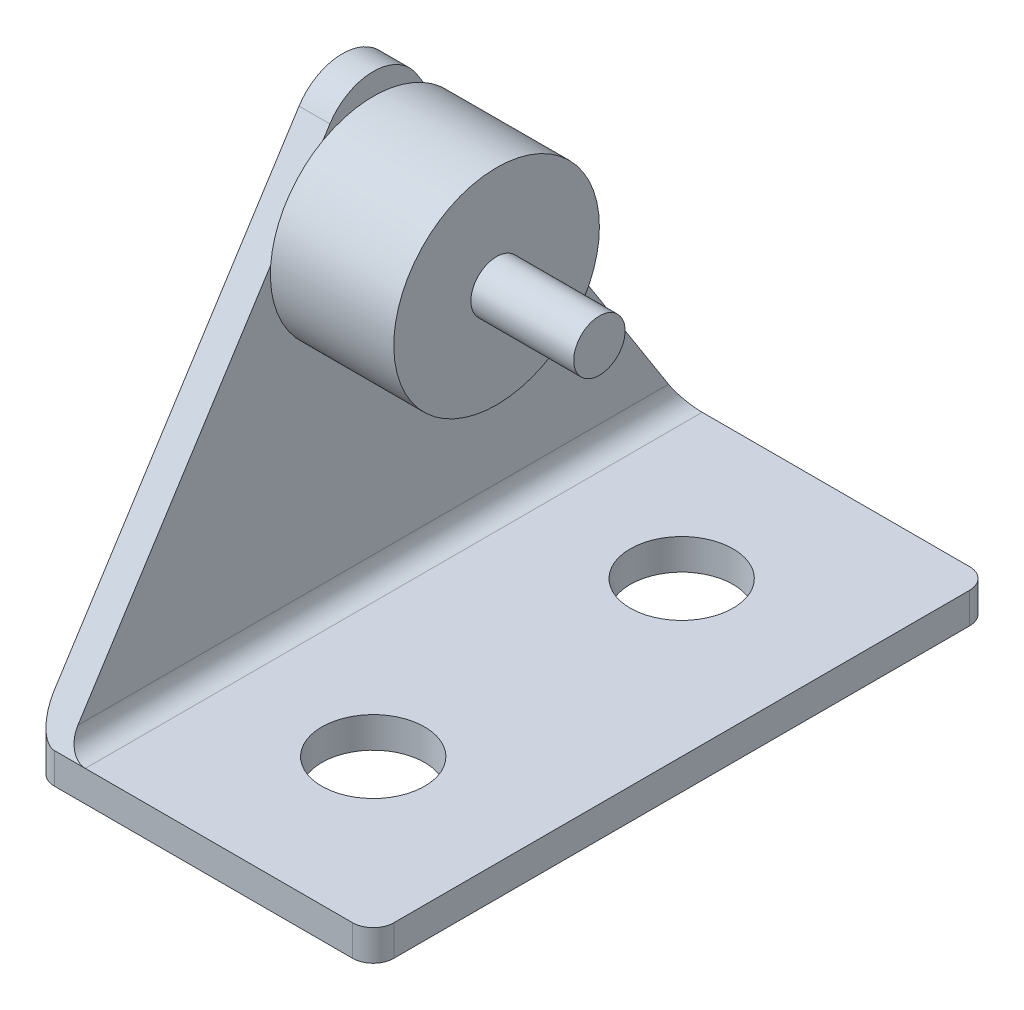
ISO-10303-21;
HEADER;
FILE_DESCRIPTION(('STEP AP214'),'2;1');
FILE_NAME('part.step','',(''),(''),'','','');
FILE_SCHEMA(('AUTOMOTIVE_DESIGN { 1 0 10303 214 1 1 1 1 }'));
ENDSEC;
DATA;
#1=APPLICATION_CONTEXT('core data for automotive mechanical design processes');
#2=APPLICATION_PROTOCOL_DEFINITION('international standard','automotive_design',2000,#1);
#3=PRODUCT_CONTEXT('',#1,'mechanical');
#4=PRODUCT('Part','Part','',(#3));
#5=PRODUCT_RELATED_PRODUCT_CATEGORY('part','',(#4));
#6=PRODUCT_DEFINITION_FORMATION('','',#4);
#7=PRODUCT_DEFINITION_CONTEXT('part definition',#1,'design');
#8=PRODUCT_DEFINITION('design','',#6,#7);
#9=PRODUCT_DEFINITION_SHAPE('','',#8);
#10=(LENGTH_UNIT() NAMED_UNIT(*) SI_UNIT(.MILLI.,.METRE.));
#11=(NAMED_UNIT(*) PLANE_ANGLE_UNIT() SI_UNIT($,.RADIAN.));
#12=(NAMED_UNIT(*) SI_UNIT($,.STERADIAN.) SOLID_ANGLE_UNIT());
#13=UNCERTAINTY_MEASURE_WITH_UNIT(LENGTH_MEASURE(1.E-05),#10,'distance_accuracy_value','');
#14=(GEOMETRIC_REPRESENTATION_CONTEXT(3) GLOBAL_UNCERTAINTY_ASSIGNED_CONTEXT((#13)) GLOBAL_UNIT_ASSIGNED_CONTEXT((#10,
#11,#12)) REPRESENTATION_CONTEXT('',''));
#15=CARTESIAN_POINT('',(0.,0.,0.));
#16=DIRECTION('',(0.,0.,1.));
#17=DIRECTION('',(1.,0.,0.));
#18=AXIS2_PLACEMENT_3D('',#15,#16,#17);
#19=CARTESIAN_POINT('',(3.81,3.80999999999999,38.1));
#20=DIRECTION('',(-1.,0.,0.));
#21=DIRECTION('',(0.,0.,1.));
#22=AXIS2_PLACEMENT_3D('',#19,#20,#21);
#23=PLANE('',#22);
#24=CARTESIAN_POINT('',(3.81,42.6920214745365,0.));
#25=DIRECTION('',(1.,0.,0.));
#26=DIRECTION('',(0.,0.,-1.));
#27=AXIS2_PLACEMENT_3D('',#24,#25,#26);
#28=CIRCLE('',#27,12.7);
#29=CARTESIAN_POINT('',(3.81,53.7697444122996,-6.21080143895773));
#30=VERTEX_POINT('',#29);
#31=CARTESIAN_POINT('',(3.81,53.7697444122995,6.21080143895775));
#32=VERTEX_POINT('',#31);
#33=EDGE_CURVE('E193',#30,#32,#28,.T.);
#34=ORIENTED_EDGE('',*,*,#33,.F.);
#35=DIRECTION('',(0.,-0.842922209577588,-0.538035452921865));
#36=VECTOR('',#35,1.);
#37=CARTESIAN_POINT('',(3.81,18.3821164361531,-28.7986490833065));
#38=LINE('',#37,#36);
#39=CARTESIAN_POINT('',(3.81,55.1143288850523,-5.35255603081767));
#40=VERTEX_POINT('',#39);
#41=EDGE_CURVE('E203',#40,#30,#38,.T.);
#42=ORIENTED_EDGE('',*,*,#41,.F.);
#43=CARTESIAN_POINT('',(3.80999999999999,51.6978037589984,0.));
#44=DIRECTION('',(-1.,0.,0.));
#45=DIRECTION('',(0.,0.,1.));
#46=AXIS2_PLACEMENT_3D('',#43,#44,#45);
#47=CIRCLE('',#46,6.35);
#48=CARTESIAN_POINT('',(3.81,55.1143288850523,5.3525560308177));
#49=VERTEX_POINT('',#48);
#50=EDGE_CURVE('E261',#40,#49,#47,.F.);
#51=ORIENTED_EDGE('',*,*,#50,.T.);
#52=DIRECTION('',(0.,0.842922209577588,-0.538035452921865));
#53=VECTOR('',#52,1.);
#54=CARTESIAN_POINT('',(3.81,18.3821164361531,28.7986490833065));
#55=LINE('',#54,#53);
#56=EDGE_CURVE('E204',#32,#49,#55,.T.);
#57=ORIENTED_EDGE('',*,*,#56,.F.);
#58=EDGE_LOOP('',(#34,#42,#51,#57));
#59=FACE_BOUND('',#58,.T.);
#60=ADVANCED_FACE('F77',(#59),#23,.F.);
#61=CARTESIAN_POINT('',(0.,0.,38.1));
#62=DIRECTION('',(0.,1.,0.));
#63=DIRECTION('',(0.,0.,1.));
#64=AXIS2_PLACEMENT_3D('',#61,#62,#63);
#65=PLANE('',#64);
#66=CARTESIAN_POINT('',(22.86,0.,19.05));
#67=DIRECTION('',(0.,1.,0.));
#68=DIRECTION('',(0.,0.,1.));
#69=AXIS2_PLACEMENT_3D('',#66,#67,#68);
#70=CIRCLE('',#69,6.35);
#71=CARTESIAN_POINT('',(16.51,0.,19.05));
#72=VERTEX_POINT('',#71);
#73=EDGE_CURVE('E394',#72,#72,#70,.T.);
#74=ORIENTED_EDGE('',*,*,#73,.T.);
#75=EDGE_LOOP('',(#74));
#76=FACE_BOUND('',#75,.T.);
#77=CARTESIAN_POINT('',(22.86,0.,-19.05));
#78=DIRECTION('',(0.,1.,0.));
#79=DIRECTION('',(0.,0.,1.));
#80=AXIS2_PLACEMENT_3D('',#77,#78,#79);
#81=CIRCLE('',#80,6.35);
#82=CARTESIAN_POINT('',(16.51,0.,-19.05));
#83=VERTEX_POINT('',#82);
#84=EDGE_CURVE('E399',#83,#83,#81,.T.);
#85=ORIENTED_EDGE('',*,*,#84,.T.);
#86=EDGE_LOOP('',(#85));
#87=FACE_BOUND('',#86,.T.);
#88=DIRECTION('',(0.,0.,-1.));
#89=VECTOR('',#88,1.);
#90=CARTESIAN_POINT('',(0.,0.,38.1));
#91=LINE('',#90,#89);
#92=CARTESIAN_POINT('',(0.,0.,35.56));
#93=VERTEX_POINT('',#92);
#94=CARTESIAN_POINT('',(0.,0.,-35.56));
#95=VERTEX_POINT('',#94);
#96=EDGE_CURVE('E246',#93,#95,#91,.T.);
#97=ORIENTED_EDGE('',*,*,#96,.T.);
#98=CARTESIAN_POINT('',(2.54,0.,-35.56));
#99=DIRECTION('',(0.,1.,0.));
#100=DIRECTION('',(0.,0.,1.));
#101=AXIS2_PLACEMENT_3D('',#98,#99,#100);
#102=CIRCLE('',#101,2.54);
#103=CARTESIAN_POINT('',(2.54,0.,-38.1));
#104=VERTEX_POINT('',#103);
#105=EDGE_CURVE('E287',#95,#104,#102,.F.);
#106=ORIENTED_EDGE('',*,*,#105,.T.);
#107=DIRECTION('',(1.,0.,0.));
#108=VECTOR('',#107,1.);
#109=CARTESIAN_POINT('',(0.,0.,-38.1));
#110=LINE('',#109,#108);
#111=CARTESIAN_POINT('',(39.37,0.,-38.1));
#112=VERTEX_POINT('',#111);
#113=EDGE_CURVE('E236',#104,#112,#110,.T.);
#114=ORIENTED_EDGE('',*,*,#113,.T.);
#115=CARTESIAN_POINT('',(39.37,0.,-35.56));
#116=DIRECTION('',(0.,1.,0.));
#117=DIRECTION('',(0.,0.,1.));
#118=AXIS2_PLACEMENT_3D('',#115,#116,#117);
#119=CIRCLE('',#118,2.54);
#120=CARTESIAN_POINT('',(41.91,0.,-35.56));
#121=VERTEX_POINT('',#120);
#122=EDGE_CURVE('E281',#112,#121,#119,.F.);
#123=ORIENTED_EDGE('',*,*,#122,.T.);
#124=DIRECTION('',(0.,0.,1.));
#125=VECTOR('',#124,1.);
#126=CARTESIAN_POINT('',(41.91,0.,38.1));
#127=LINE('',#126,#125);
#128=CARTESIAN_POINT('',(41.91,0.,35.56));
#129=VERTEX_POINT('',#128);
#130=EDGE_CURVE('E222',#121,#129,#127,.T.);
#131=ORIENTED_EDGE('',*,*,#130,.T.);
#132=CARTESIAN_POINT('',(39.37,0.,35.56));
#133=DIRECTION('',(0.,1.,0.));
#134=DIRECTION('',(0.,0.,1.));
#135=AXIS2_PLACEMENT_3D('',#132,#133,#134);
#136=CIRCLE('',#135,2.54);
#137=CARTESIAN_POINT('',(39.37,0.,38.1));
#138=VERTEX_POINT('',#137);
#139=EDGE_CURVE('E278',#129,#138,#136,.F.);
#140=ORIENTED_EDGE('',*,*,#139,.T.);
#141=DIRECTION('',(1.,0.,0.));
#142=VECTOR('',#141,1.);
#143=CARTESIAN_POINT('',(0.,0.,38.1));
#144=LINE('',#143,#142);
#145=CARTESIAN_POINT('',(2.54,0.,38.1));
#146=VERTEX_POINT('',#145);
#147=EDGE_CURVE('E237',#146,#138,#144,.T.);
#148=ORIENTED_EDGE('',*,*,#147,.F.);
#149=CARTESIAN_POINT('',(2.54,0.,35.56));
#150=DIRECTION('',(0.,1.,0.));
#151=DIRECTION('',(0.,0.,1.));
#152=AXIS2_PLACEMENT_3D('',#149,#150,#151);
#153=CIRCLE('',#152,2.54);
#154=EDGE_CURVE('E284',#146,#93,#153,.F.);
#155=ORIENTED_EDGE('',*,*,#154,.T.);
#156=EDGE_LOOP('',(#97,#106,#114,#123,#131,#140,#148,#155));
#157=FACE_BOUND('',#156,.T.);
#158=ADVANCED_FACE('F358',(#76,#87,#157),#65,.F.);
#159=CARTESIAN_POINT('',(63.5,3.81,38.1));
#160=DIRECTION('',(0.,-1.,0.));
#161=DIRECTION('',(1.,0.,0.));
#162=AXIS2_PLACEMENT_3D('',#159,#160,#161);
#163=PLANE('',#162);
#164=CARTESIAN_POINT('',(22.86,3.80999999999999,19.05));
#165=DIRECTION('',(0.,1.,0.));
#166=DIRECTION('',(-1.,0.,0.));
#167=AXIS2_PLACEMENT_3D('',#164,#165,#166);
#168=CIRCLE('',#167,6.35);
#169=CARTESIAN_POINT('',(16.51,3.80999999999999,19.05));
#170=VERTEX_POINT('',#169);
#171=EDGE_CURVE('E403',#170,#170,#168,.T.);
#172=ORIENTED_EDGE('',*,*,#171,.F.);
#173=EDGE_LOOP('',(#172));
#174=FACE_BOUND('',#173,.T.);
#175=CARTESIAN_POINT('',(22.86,3.80999999999999,-19.05));
#176=DIRECTION('',(0.,1.,0.));
#177=DIRECTION('',(-1.,0.,0.));
#178=AXIS2_PLACEMENT_3D('',#175,#176,#177);
#179=CIRCLE('',#178,6.35);
#180=CARTESIAN_POINT('',(16.51,3.80999999999999,-19.05));
#181=VERTEX_POINT('',#180);
#182=EDGE_CURVE('E404',#181,#181,#179,.T.);
#183=ORIENTED_EDGE('',*,*,#182,.F.);
#184=EDGE_LOOP('',(#183));
#185=FACE_BOUND('',#184,.T.);
#186=DIRECTION('',(-1.,0.,0.));
#187=VECTOR('',#186,1.);
#188=CARTESIAN_POINT('',(63.5,3.81,-38.1));
#189=LINE('',#188,#187);
#190=CARTESIAN_POINT('',(39.37,3.81,-38.1));
#191=VERTEX_POINT('',#190);
#192=CARTESIAN_POINT('',(6.35000000000002,3.80999999999999,-38.1));
#193=VERTEX_POINT('',#192);
#194=EDGE_CURVE('E242',#191,#193,#189,.T.);
#195=ORIENTED_EDGE('',*,*,#194,.T.);
#196=DIRECTION('',(0.,0.,-1.));
#197=VECTOR('',#196,1.);
#198=CARTESIAN_POINT('',(6.35,3.80999999999999,38.1));
#199=LINE('',#198,#197);
#200=CARTESIAN_POINT('',(6.35,3.80999999999999,38.1));
#201=VERTEX_POINT('',#200);
#202=EDGE_CURVE('E327',#193,#201,#199,.F.);
#203=ORIENTED_EDGE('',*,*,#202,.T.);
#204=DIRECTION('',(-1.,0.,0.));
#205=VECTOR('',#204,1.);
#206=CARTESIAN_POINT('',(63.5,3.81,38.1));
#207=LINE('',#206,#205);
#208=CARTESIAN_POINT('',(39.37,3.81,38.1));
#209=VERTEX_POINT('',#208);
#210=EDGE_CURVE('E241',#209,#201,#207,.T.);
#211=ORIENTED_EDGE('',*,*,#210,.F.);
#212=CARTESIAN_POINT('',(39.37,3.81,35.56));
#213=DIRECTION('',(0.,-1.,0.));
#214=DIRECTION('',(1.,0.,0.));
#215=AXIS2_PLACEMENT_3D('',#212,#213,#214);
#216=CIRCLE('',#215,2.54);
#217=CARTESIAN_POINT('',(41.91,3.81,35.56));
#218=VERTEX_POINT('',#217);
#219=EDGE_CURVE('E317',#209,#218,#216,.F.);
#220=ORIENTED_EDGE('',*,*,#219,.T.);
#221=DIRECTION('',(0.,0.,1.));
#222=VECTOR('',#221,1.);
#223=CARTESIAN_POINT('',(41.91,3.81,38.1));
#224=LINE('',#223,#222);
#225=CARTESIAN_POINT('',(41.91,3.81,-35.56));
#226=VERTEX_POINT('',#225);
#227=EDGE_CURVE('E386',#226,#218,#224,.T.);
#228=ORIENTED_EDGE('',*,*,#227,.F.);
#229=CARTESIAN_POINT('',(39.37,3.80999999999999,-35.56));
#230=DIRECTION('',(0.,-1.,0.));
#231=DIRECTION('',(1.,0.,0.));
#232=AXIS2_PLACEMENT_3D('',#229,#230,#231);
#233=CIRCLE('',#232,2.54);
#234=EDGE_CURVE('E320',#226,#191,#233,.F.);
#235=ORIENTED_EDGE('',*,*,#234,.T.);
#236=EDGE_LOOP('',(#195,#203,#211,#220,#228,#235));
#237=FACE_BOUND('',#236,.T.);
#238=ADVANCED_FACE('F370',(#174,#185,#237),#163,.F.);
#239=CARTESIAN_POINT('',(3.81,43.661375199956,12.6629520000281));
#240=VERTEX_POINT('',#239);
#241=CARTESIAN_POINT('',(3.81,43.661375199956,-12.6629520000281));
#242=VERTEX_POINT('',#241);
#243=EDGE_CURVE('E196',#240,#242,#28,.T.);
#244=ORIENTED_EDGE('',*,*,#243,.F.);
#245=CARTESIAN_POINT('',(3.81,6.34999999999999,36.4787234042553));
#246=VERTEX_POINT('',#245);
#247=EDGE_CURVE('E229',#246,#240,#55,.T.);
#248=ORIENTED_EDGE('',*,*,#247,.F.);
#249=DIRECTION('',(0.,0.,-1.));
#250=VECTOR('',#249,1.);
#251=CARTESIAN_POINT('',(3.81,6.34999999999999,-38.1));
#252=LINE('',#251,#250);
#253=CARTESIAN_POINT('',(3.81,6.34999999999999,-36.4787234042553));
#254=VERTEX_POINT('',#253);
#255=EDGE_CURVE('E323',#246,#254,#252,.T.);
#256=ORIENTED_EDGE('',*,*,#255,.T.);
#257=EDGE_CURVE('E214',#242,#254,#38,.T.);
#258=ORIENTED_EDGE('',*,*,#257,.F.);
#259=EDGE_LOOP('',(#244,#248,#256,#258));
#260=FACE_BOUND('',#259,.T.);
#261=ADVANCED_FACE('F346',(#260),#23,.F.);
#262=CARTESIAN_POINT('',(0.,0.,38.1));
#263=DIRECTION('',(1.,0.,0.));
#264=DIRECTION('',(0.,0.,-1.));
#265=AXIS2_PLACEMENT_3D('',#262,#263,#264);
#266=PLANE('',#265);
#267=CARTESIAN_POINT('',(0.,42.6920214745365,0.));
#268=DIRECTION('',(1.,0.,0.));
#269=DIRECTION('',(0.,0.,-1.));
#270=AXIS2_PLACEMENT_3D('',#267,#268,#269);
#271=CIRCLE('',#270,6.5024);
#272=CARTESIAN_POINT('',(0.,42.6920214745365,-6.5024));
#273=VERTEX_POINT('',#272);
#274=EDGE_CURVE('E81',#273,#273,#271,.T.);
#275=ORIENTED_EDGE('',*,*,#274,.T.);
#276=EDGE_LOOP('',(#275));
#277=FACE_BOUND('',#276,.T.);
#278=DIRECTION('',(0.,-0.842922209577588,-0.538035452921865));
#279=VECTOR('',#278,1.);
#280=CARTESIAN_POINT('',(0.,35.661305886137,-17.7693792216147));
#281=LINE('',#280,#279);
#282=CARTESIAN_POINT('',(0.,55.1143288850523,-5.35255603081768));
#283=VERTEX_POINT('',#282);
#284=CARTESIAN_POINT('',(0.,7.78933333333333,-35.56));
#285=VERTEX_POINT('',#284);
#286=EDGE_CURVE('E220',#283,#285,#281,.T.);
#287=ORIENTED_EDGE('',*,*,#286,.T.);
#288=DIRECTION('',(0.,-1.,0.));
#289=VECTOR('',#288,1.);
#290=CARTESIAN_POINT('',(0.,0.,-35.56));
#291=LINE('',#290,#289);
#292=EDGE_CURVE('E274',#285,#95,#291,.T.);
#293=ORIENTED_EDGE('',*,*,#292,.T.);
#294=ORIENTED_EDGE('',*,*,#96,.F.);
#295=DIRECTION('',(0.,-1.,0.));
#296=VECTOR('',#295,1.);
#297=CARTESIAN_POINT('',(0.,0.,35.56));
#298=LINE('',#297,#296);
#299=CARTESIAN_POINT('',(0.,7.78933333333333,35.56));
#300=VERTEX_POINT('',#299);
#301=EDGE_CURVE('E271',#93,#300,#298,.F.);
#302=ORIENTED_EDGE('',*,*,#301,.T.);
#303=DIRECTION('',(0.,0.842922209577588,-0.538035452921865));
#304=VECTOR('',#303,1.);
#305=CARTESIAN_POINT('',(0.,1.10292698616918,39.8279189449984));
#306=LINE('',#305,#304);
#307=CARTESIAN_POINT('',(0.,55.1143288850523,5.3525560308177));
#308=VERTEX_POINT('',#307);
#309=EDGE_CURVE('E233',#300,#308,#306,.T.);
#310=ORIENTED_EDGE('',*,*,#309,.T.);
#311=CARTESIAN_POINT('',(0.,51.6978037589984,0.));
#312=DIRECTION('',(1.,0.,0.));
#313=DIRECTION('',(0.,0.,-1.));
#314=AXIS2_PLACEMENT_3D('',#311,#312,#313);
#315=CIRCLE('',#314,6.35);
#316=EDGE_CURVE('E268',#308,#283,#315,.F.);
#317=ORIENTED_EDGE('',*,*,#316,.T.);
#318=EDGE_LOOP('',(#287,#293,#294,#302,#310,#317));
#319=FACE_BOUND('',#318,.T.);
#320=ADVANCED_FACE('F355',(#277,#319),#266,.F.);
#321=CARTESIAN_POINT('',(0.,0.,38.1));
#322=DIRECTION('',(0.,0.,-1.));
#323=DIRECTION('',(-1.,0.,0.));
#324=AXIS2_PLACEMENT_3D('',#321,#322,#323);
#325=PLANE('',#324);
#326=DIRECTION('',(-1.,0.,0.));
#327=VECTOR('',#326,1.);
#328=CARTESIAN_POINT('',(0.,3.80999999999999,38.1));
#329=LINE('',#328,#327);
#330=CARTESIAN_POINT('',(2.54,3.80999999999999,38.1));
#331=VERTEX_POINT('',#330);
#332=EDGE_CURVE('E255',#201,#331,#329,.T.);
#333=ORIENTED_EDGE('',*,*,#332,.T.);
#334=DIRECTION('',(0.,-1.,0.));
#335=VECTOR('',#334,1.);
#336=CARTESIAN_POINT('',(2.54,0.,38.1));
#337=LINE('',#336,#335);
#338=EDGE_CURVE('E303',#331,#146,#337,.T.);
#339=ORIENTED_EDGE('',*,*,#338,.T.);
#340=ORIENTED_EDGE('',*,*,#147,.T.);
#341=DIRECTION('',(0.,1.,0.));
#342=VECTOR('',#341,1.);
#343=CARTESIAN_POINT('',(39.37,0.,38.1));
#344=LINE('',#343,#342);
#345=EDGE_CURVE('E299',#138,#209,#344,.T.);
#346=ORIENTED_EDGE('',*,*,#345,.T.);
#347=ORIENTED_EDGE('',*,*,#210,.T.);
#348=EDGE_LOOP('',(#333,#339,#340,#346,#347));
#349=FACE_BOUND('',#348,.T.);
#350=ADVANCED_FACE('F366',(#349),#325,.F.);
#351=CARTESIAN_POINT('',(0.,0.,-38.1));
#352=DIRECTION('',(0.,0.,-1.));
#353=DIRECTION('',(-1.,0.,0.));
#354=AXIS2_PLACEMENT_3D('',#351,#352,#353);
#355=PLANE('',#354);
#356=ORIENTED_EDGE('',*,*,#113,.F.);
#357=DIRECTION('',(0.,-1.,0.));
#358=VECTOR('',#357,1.);
#359=CARTESIAN_POINT('',(2.54,3.80999999999999,-38.1));
#360=LINE('',#359,#358);
#361=CARTESIAN_POINT('',(2.53999999999997,3.80999999999999,-38.1));
#362=VERTEX_POINT('',#361);
#363=EDGE_CURVE('E293',#104,#362,#360,.F.);
#364=ORIENTED_EDGE('',*,*,#363,.T.);
#365=DIRECTION('',(1.,0.,0.));
#366=VECTOR('',#365,1.);
#367=CARTESIAN_POINT('',(-72.39,3.80999999999999,-38.1));
#368=LINE('',#367,#366);
#369=EDGE_CURVE('E103',#362,#193,#368,.T.);
#370=ORIENTED_EDGE('',*,*,#369,.T.);
#371=ORIENTED_EDGE('',*,*,#194,.F.);
#372=DIRECTION('',(0.,1.,0.));
#373=VECTOR('',#372,1.);
#374=CARTESIAN_POINT('',(39.37,0.,-38.1));
#375=LINE('',#374,#373);
#376=EDGE_CURVE('E290',#191,#112,#375,.F.);
#377=ORIENTED_EDGE('',*,*,#376,.T.);
#378=EDGE_LOOP('',(#356,#364,#370,#371,#377));
#379=FACE_BOUND('',#378,.T.);
#380=ADVANCED_FACE('F374',(#379),#355,.T.);
#381=CARTESIAN_POINT('',(-72.39,18.3821164361531,28.7986490833065));
#382=DIRECTION('',(0.,-0.538035452921865,-0.842922209577588));
#383=DIRECTION('',(0.,0.842922209577589,-0.538035452921865));
#384=AXIS2_PLACEMENT_3D('',#381,#382,#383);
#385=PLANE('',#384);
#386=ORIENTED_EDGE('',*,*,#309,.F.);
#387=CARTESIAN_POINT('',(2.54,7.78933333333332,35.56));
#388=DIRECTION('',(0.,-0.538035452921865,-0.842922209577588));
#389=DIRECTION('',(0.,-0.842922209577588,0.538035452921865));
#390=AXIS2_PLACEMENT_3D('',#387,#388,#389);
#391=ELLIPSE('',#390,4.72087849640062,2.54);
#392=EDGE_CURVE('E307',#300,#331,#391,.F.);
#393=ORIENTED_EDGE('',*,*,#392,.T.);
#394=ORIENTED_EDGE('',*,*,#332,.F.);
#395=CARTESIAN_POINT('',(6.35,6.34999999999999,36.4787234042553));
#396=DIRECTION('',(0.,-0.538035452921865,-0.842922209577588));
#397=DIRECTION('',(0.,-0.842922209577588,0.538035452921865));
#398=AXIS2_PLACEMENT_3D('',#395,#396,#397);
#399=ELLIPSE('',#398,3.01332669983018,2.54);
#400=EDGE_CURVE('E87',#201,#246,#399,.T.);
#401=ORIENTED_EDGE('',*,*,#400,.T.);
#402=ORIENTED_EDGE('',*,*,#247,.T.);
#403=DIRECTION('',(0.,-0.842922209577589,0.538035452921865));
#404=VECTOR('',#403,1.);
#405=CARTESIAN_POINT('',(3.80999999999999,18.3821164361531,28.7986490833065));
#406=LINE('',#405,#404);
#407=EDGE_CURVE('E185',#32,#240,#406,.T.);
#408=ORIENTED_EDGE('',*,*,#407,.F.);
#409=ORIENTED_EDGE('',*,*,#56,.T.);
#410=DIRECTION('',(1.,0.,0.));
#411=VECTOR('',#410,1.);
#412=CARTESIAN_POINT('',(-72.39,55.1143288850523,5.35255603081769));
#413=LINE('',#412,#411);
#414=EDGE_CURVE('E264',#49,#308,#413,.F.);
#415=ORIENTED_EDGE('',*,*,#414,.T.);
#416=EDGE_LOOP('',(#386,#393,#394,#401,#402,#408,#409,#415));
#417=FACE_BOUND('',#416,.T.);
#418=ADVANCED_FACE('F341',(#417),#385,.F.);
#419=CARTESIAN_POINT('',(-72.39,18.3821164361531,-28.7986490833065));
#420=DIRECTION('',(0.,-0.538035452921865,0.842922209577588));
#421=DIRECTION('',(0.,-0.842922209577588,-0.538035452921865));
#422=AXIS2_PLACEMENT_3D('',#419,#420,#421);
#423=PLANE('',#422);
#424=ORIENTED_EDGE('',*,*,#369,.F.);
#425=CARTESIAN_POINT('',(2.54,7.78933333333333,-35.56));
#426=DIRECTION('',(0.,-0.538035452921865,0.842922209577588));
#427=DIRECTION('',(0.,0.842922209577588,0.538035452921865));
#428=AXIS2_PLACEMENT_3D('',#425,#426,#427);
#429=ELLIPSE('',#428,4.72087849640062,2.54);
#430=EDGE_CURVE('E296',#362,#285,#429,.F.);
#431=ORIENTED_EDGE('',*,*,#430,.T.);
#432=ORIENTED_EDGE('',*,*,#286,.F.);
#433=DIRECTION('',(1.,0.,0.));
#434=VECTOR('',#433,1.);
#435=CARTESIAN_POINT('',(-72.39,55.1143288850523,-5.35255603081768));
#436=LINE('',#435,#434);
#437=EDGE_CURVE('E212',#283,#40,#436,.T.);
#438=ORIENTED_EDGE('',*,*,#437,.T.);
#439=ORIENTED_EDGE('',*,*,#41,.T.);
#440=DIRECTION('',(0.,0.842922209577588,0.538035452921865));
#441=VECTOR('',#440,1.);
#442=CARTESIAN_POINT('',(3.80999999999999,18.3821164361531,-28.7986490833065));
#443=LINE('',#442,#441);
#444=EDGE_CURVE('E180',#242,#30,#443,.T.);
#445=ORIENTED_EDGE('',*,*,#444,.F.);
#446=ORIENTED_EDGE('',*,*,#257,.T.);
#447=CARTESIAN_POINT('',(6.35,6.34999999999999,-36.4787234042553));
#448=DIRECTION('',(0.,-0.538035452921865,0.842922209577588));
#449=DIRECTION('',(0.,0.842922209577588,0.538035452921865));
#450=AXIS2_PLACEMENT_3D('',#447,#448,#449);
#451=ELLIPSE('',#450,3.01332669983018,2.54);
#452=EDGE_CURVE('E331',#254,#193,#451,.T.);
#453=ORIENTED_EDGE('',*,*,#452,.T.);
#454=EDGE_LOOP('',(#424,#431,#432,#438,#439,#445,#446,#453));
#455=FACE_BOUND('',#454,.T.);
#456=ADVANCED_FACE('F209',(#455),#423,.F.);
#457=CARTESIAN_POINT('',(-72.39,51.6978037589984,0.));
#458=DIRECTION('',(1.,0.,0.));
#459=DIRECTION('',(0.,0.,-1.));
#460=AXIS2_PLACEMENT_3D('',#457,#458,#459);
#461=CYLINDRICAL_SURFACE('',#460,6.35);
#462=ORIENTED_EDGE('',*,*,#316,.F.);
#463=ORIENTED_EDGE('',*,*,#414,.F.);
#464=ORIENTED_EDGE('',*,*,#50,.F.);
#465=ORIENTED_EDGE('',*,*,#437,.F.);
#466=EDGE_LOOP('',(#462,#463,#464,#465));
#467=FACE_BOUND('',#466,.T.);
#468=ADVANCED_FACE('F475',(#467),#461,.T.);
#469=CARTESIAN_POINT('',(41.91,-72.39,38.1));
#470=DIRECTION('',(-1.,0.,0.));
#471=DIRECTION('',(0.,-1.,0.));
#472=AXIS2_PLACEMENT_3D('',#469,#470,#471);
#473=PLANE('',#472);
#474=ORIENTED_EDGE('',*,*,#130,.F.);
#475=DIRECTION('',(0.,1.,0.));
#476=VECTOR('',#475,1.);
#477=CARTESIAN_POINT('',(41.91,3.80999999999999,-35.56));
#478=LINE('',#477,#476);
#479=EDGE_CURVE('E313',#121,#226,#478,.T.);
#480=ORIENTED_EDGE('',*,*,#479,.T.);
#481=ORIENTED_EDGE('',*,*,#227,.T.);
#482=DIRECTION('',(0.,1.,0.));
#483=VECTOR('',#482,1.);
#484=CARTESIAN_POINT('',(41.91,-72.39,35.56));
#485=LINE('',#484,#483);
#486=EDGE_CURVE('E310',#218,#129,#485,.F.);
#487=ORIENTED_EDGE('',*,*,#486,.T.);
#488=EDGE_LOOP('',(#474,#480,#481,#487));
#489=FACE_BOUND('',#488,.T.);
#490=ADVANCED_FACE('F383',(#489),#473,.F.);
#491=CARTESIAN_POINT('',(2.54,0.,-35.56));
#492=DIRECTION('',(0.,1.,0.));
#493=DIRECTION('',(0.,0.,1.));
#494=AXIS2_PLACEMENT_3D('',#491,#492,#493);
#495=CYLINDRICAL_SURFACE('',#494,2.54);
#496=ORIENTED_EDGE('',*,*,#430,.F.);
#497=ORIENTED_EDGE('',*,*,#363,.F.);
#498=ORIENTED_EDGE('',*,*,#105,.F.);
#499=ORIENTED_EDGE('',*,*,#292,.F.);
#500=EDGE_LOOP('',(#496,#497,#498,#499));
#501=FACE_BOUND('',#500,.T.);
#502=ADVANCED_FACE('F352',(#501),#495,.T.);
#503=CARTESIAN_POINT('',(2.54,0.,35.56));
#504=DIRECTION('',(0.,-1.,0.));
#505=DIRECTION('',(0.,0.,-1.));
#506=AXIS2_PLACEMENT_3D('',#503,#504,#505);
#507=CYLINDRICAL_SURFACE('',#506,2.54);
#508=ORIENTED_EDGE('',*,*,#392,.F.);
#509=ORIENTED_EDGE('',*,*,#301,.F.);
#510=ORIENTED_EDGE('',*,*,#154,.F.);
#511=ORIENTED_EDGE('',*,*,#338,.F.);
#512=EDGE_LOOP('',(#508,#509,#510,#511));
#513=FACE_BOUND('',#512,.T.);
#514=ADVANCED_FACE('F364',(#513),#507,.T.);
#515=CARTESIAN_POINT('',(39.37,-72.39,-35.56));
#516=DIRECTION('',(0.,-1.,0.));
#517=DIRECTION('',(1.,0.,0.));
#518=AXIS2_PLACEMENT_3D('',#515,#516,#517);
#519=CYLINDRICAL_SURFACE('',#518,2.54);
#520=ORIENTED_EDGE('',*,*,#122,.F.);
#521=ORIENTED_EDGE('',*,*,#376,.F.);
#522=ORIENTED_EDGE('',*,*,#234,.F.);
#523=ORIENTED_EDGE('',*,*,#479,.F.);
#524=EDGE_LOOP('',(#520,#521,#522,#523));
#525=FACE_BOUND('',#524,.T.);
#526=ADVANCED_FACE('F377',(#525),#519,.T.);
#527=CARTESIAN_POINT('',(39.37,0.,35.56));
#528=DIRECTION('',(0.,1.,0.));
#529=DIRECTION('',(-1.,0.,0.));
#530=AXIS2_PLACEMENT_3D('',#527,#528,#529);
#531=CYLINDRICAL_SURFACE('',#530,2.54);
#532=ORIENTED_EDGE('',*,*,#139,.F.);
#533=ORIENTED_EDGE('',*,*,#486,.F.);
#534=ORIENTED_EDGE('',*,*,#219,.F.);
#535=ORIENTED_EDGE('',*,*,#345,.F.);
#536=EDGE_LOOP('',(#532,#533,#534,#535));
#537=FACE_BOUND('',#536,.T.);
#538=ADVANCED_FACE('F484',(#537),#531,.T.);
#539=CARTESIAN_POINT('',(6.35,6.34999999999999,38.1));
#540=DIRECTION('',(0.,0.,1.));
#541=DIRECTION('',(1.,0.,0.));
#542=AXIS2_PLACEMENT_3D('',#539,#540,#541);
#543=CYLINDRICAL_SURFACE('',#542,2.54);
#544=ORIENTED_EDGE('',*,*,#400,.F.);
#545=ORIENTED_EDGE('',*,*,#202,.F.);
#546=ORIENTED_EDGE('',*,*,#452,.F.);
#547=ORIENTED_EDGE('',*,*,#255,.F.);
#548=EDGE_LOOP('',(#544,#545,#546,#547));
#549=FACE_BOUND('',#548,.T.);
#550=ADVANCED_FACE('F79',(#549),#543,.F.);
#551=CARTESIAN_POINT('',(-72.39,42.6920214745365,0.));
#552=DIRECTION('',(1.,0.,0.));
#553=DIRECTION('',(0.,0.,-1.));
#554=AXIS2_PLACEMENT_3D('',#551,#552,#553);
#555=CYLINDRICAL_SURFACE('',#554,6.5024);
#556=CARTESIAN_POINT('',(6.604,42.6920214745365,0.));
#557=DIRECTION('',(-1.,0.,0.));
#558=DIRECTION('',(0.,0.,1.));
#559=AXIS2_PLACEMENT_3D('',#556,#557,#558);
#560=CIRCLE('',#559,6.5024);
#561=CARTESIAN_POINT('',(6.60400000000001,42.6920214745365,-6.5024));
#562=VERTEX_POINT('',#561);
#563=EDGE_CURVE('E416',#562,#562,#560,.T.);
#564=CARTESIAN_POINT('',(0.,42.6920214745365,-6.5024));
#565=CARTESIAN_POINT('',(0.068791666666651,42.6920214745365,-6.5024));
#566=CARTESIAN_POINT('',(0.137583333333316,42.6920214745365,-6.5024));
#567=CARTESIAN_POINT('',(0.27516666666665,42.6920214745365,-6.5024));
#568=CARTESIAN_POINT('',(0.34395833333332,42.6920214745365,-6.5024));
#569=CARTESIAN_POINT('',(0.481541666666654,42.6920214745365,-6.5024));
#570=CARTESIAN_POINT('',(0.550333333333319,42.6920214745365,-6.5024));
#571=CARTESIAN_POINT('',(0.687916666666654,42.6920214745365,-6.5024));
#572=CARTESIAN_POINT('',(0.756708333333323,42.6920214745365,-6.5024));
#573=CARTESIAN_POINT('',(0.894291666666658,42.6920214745365,-6.5024));
#574=CARTESIAN_POINT('',(0.963083333333323,42.6920214745365,-6.5024));
#575=CARTESIAN_POINT('',(1.10066666666666,42.6920214745365,-6.5024));
#576=CARTESIAN_POINT('',(1.16945833333333,42.6920214745365,-6.5024));
#577=CARTESIAN_POINT('',(1.30704166666666,42.6920214745365,-6.5024));
#578=CARTESIAN_POINT('',(1.37583333333333,42.6920214745365,-6.5024));
#579=CARTESIAN_POINT('',(1.51341666666666,42.6920214745365,-6.5024));
#580=CARTESIAN_POINT('',(1.58220833333333,42.6920214745365,-6.5024));
#581=CARTESIAN_POINT('',(1.71979166666666,42.6920214745365,-6.5024));
#582=CARTESIAN_POINT('',(1.78858333333333,42.6920214745365,-6.5024));
#583=CARTESIAN_POINT('',(1.92616666666666,42.6920214745365,-6.5024));
#584=CARTESIAN_POINT('',(1.99495833333332,42.6920214745365,-6.5024));
#585=CARTESIAN_POINT('',(2.13254166666666,42.6920214745365,-6.5024));
#586=CARTESIAN_POINT('',(2.20133333333333,42.6920214745365,-6.5024));
#587=CARTESIAN_POINT('',(2.33891666666666,42.6920214745365,-6.5024));
#588=CARTESIAN_POINT('',(2.40770833333333,42.6920214745365,-6.5024));
#589=CARTESIAN_POINT('',(2.54529166666666,42.6920214745365,-6.5024));
#590=CARTESIAN_POINT('',(2.61408333333333,42.6920214745365,-6.5024));
#591=CARTESIAN_POINT('',(2.75166666666667,42.6920214745365,-6.5024));
#592=CARTESIAN_POINT('',(2.82045833333333,42.6920214745365,-6.5024));
#593=CARTESIAN_POINT('',(2.95804166666667,42.6920214745365,-6.5024));
#594=CARTESIAN_POINT('',(3.02683333333334,42.6920214745365,-6.5024));
#595=CARTESIAN_POINT('',(3.16441666666667,42.6920214745365,-6.5024));
#596=CARTESIAN_POINT('',(3.23320833333333,42.6920214745365,-6.5024));
#597=CARTESIAN_POINT('',(3.37079166666666,42.6920214745365,-6.5024));
#598=CARTESIAN_POINT('',(3.43958333333333,42.6920214745365,-6.5024));
#599=CARTESIAN_POINT('',(3.57716666666666,42.6920214745365,-6.5024));
#600=CARTESIAN_POINT('',(3.64595833333333,42.6920214745365,-6.5024));
#601=CARTESIAN_POINT('',(3.78354166666667,42.6920214745365,-6.5024));
#602=CARTESIAN_POINT('',(3.85233333333333,42.6920214745365,-6.5024));
#603=CARTESIAN_POINT('',(3.98991666666667,42.6920214745365,-6.5024));
#604=CARTESIAN_POINT('',(4.05870833333334,42.6920214745365,-6.5024));
#605=CARTESIAN_POINT('',(4.19629166666667,42.6920214745365,-6.5024));
#606=CARTESIAN_POINT('',(4.26508333333334,42.6920214745365,-6.5024));
#607=CARTESIAN_POINT('',(4.40266666666667,42.6920214745365,-6.5024));
#608=CARTESIAN_POINT('',(4.47145833333334,42.6920214745365,-6.5024));
#609=CARTESIAN_POINT('',(4.60904166666667,42.6920214745365,-6.5024));
#610=CARTESIAN_POINT('',(4.67783333333334,42.6920214745365,-6.5024));
#611=CARTESIAN_POINT('',(4.81541666666667,42.6920214745365,-6.5024));
#612=CARTESIAN_POINT('',(4.88420833333333,42.6920214745365,-6.5024));
#613=CARTESIAN_POINT('',(5.02179166666667,42.6920214745365,-6.5024));
#614=CARTESIAN_POINT('',(5.09058333333334,42.6920214745365,-6.5024));
#615=CARTESIAN_POINT('',(5.22816666666667,42.6920214745365,-6.5024));
#616=CARTESIAN_POINT('',(5.29695833333334,42.6920214745365,-6.5024));
#617=CARTESIAN_POINT('',(5.43454166666667,42.6920214745365,-6.5024));
#618=CARTESIAN_POINT('',(5.50333333333334,42.6920214745365,-6.5024));
#619=CARTESIAN_POINT('',(5.64091666666668,42.6920214745365,-6.5024));
#620=CARTESIAN_POINT('',(5.70970833333334,42.6920214745365,-6.5024));
#621=CARTESIAN_POINT('',(5.84729166666667,42.6920214745365,-6.5024));
#622=CARTESIAN_POINT('',(5.91608333333335,42.6920214745365,-6.5024));
#623=CARTESIAN_POINT('',(6.05366666666668,42.6920214745365,-6.5024));
#624=CARTESIAN_POINT('',(6.12245833333334,42.6920214745365,-6.5024));
#625=CARTESIAN_POINT('',(6.26004166666668,42.6920214745365,-6.5024));
#626=CARTESIAN_POINT('',(6.32883333333335,42.6920214745365,-6.5024));
#627=CARTESIAN_POINT('',(6.46641666666668,42.6920214745365,-6.5024));
#628=CARTESIAN_POINT('',(6.53520833333335,42.6920214745365,-6.5024));
#629=CARTESIAN_POINT('',(6.60400000000001,42.6920214745365,-6.5024));
#630=B_SPLINE_CURVE_WITH_KNOTS('',3,(#564,#565,#566,#567,#568,#569,#570,#571,#572,#573,#574,
#575,#576,#577,#578,#579,#580,#581,#582,#583,#584,#585,#586,#587,#588,#589,#590,#591,#592,#593,
#594,#595,#596,#597,#598,#599,#600,#601,#602,#603,#604,#605,#606,#607,#608,#609,#610,#611,#612,
#613,#614,#615,#616,#617,#618,#619,#620,#621,#622,#623,#624,#625,#626,#627,#628,#629),
.UNSPECIFIED.,.F.,.F.,(4,2,2,2,2,2,2,2,2,2,2,2,2,2,2,2,2,2,2,2,2,2,2,2,2,2,2,2,2,2,2,2,4),(0.,
0.206374999999995,0.412750000000003,0.619124999999998,0.825500000000007,1.031875,
1.23825000000001,1.444625,1.65100000000001,1.85737500000001,2.06375,2.27012500000001,
2.47650000000001,2.68287500000002,2.88925000000001,3.09562500000002,3.30200000000001,
3.50837500000001,3.71475000000002,3.92112500000001,4.12750000000002,4.33387500000002,
4.54025000000002,4.74662500000002,4.95300000000001,5.15937500000002,5.36575000000002,
5.57212500000002,5.77850000000002,5.98487500000003,6.19125000000002,6.39762500000003,
6.60400000000003),.UNSPECIFIED.);
#631=EDGE_CURVE('BSEAM491',#273,#562,#630,.T.);
#632=ORIENTED_EDGE('',*,*,#274,.F.);
#633=ORIENTED_EDGE('',*,*,#563,.F.);
#634=ORIENTED_EDGE('',*,*,#631,.T.);
#635=ORIENTED_EDGE('',*,*,#631,.F.);
#636=EDGE_LOOP('',(#632,#634,#633,#635));
#637=FACE_BOUND('',#636,.T.);
#638=ADVANCED_FACE('F491',(#637),#555,.F.);
#639=CARTESIAN_POINT('',(22.86,-72.39,-19.05));
#640=DIRECTION('',(0.,1.,0.));
#641=DIRECTION('',(-1.,0.,0.));
#642=AXIS2_PLACEMENT_3D('',#639,#640,#641);
#643=CYLINDRICAL_SURFACE('',#642,6.35);
#644=CARTESIAN_POINT('',(16.51,3.80999999999999,-19.05));
#645=CARTESIAN_POINT('',(16.51,3.77031249999999,-19.05));
#646=CARTESIAN_POINT('',(16.51,3.73062499999999,-19.05));
#647=CARTESIAN_POINT('',(16.51,3.65124999999999,-19.05));
#648=CARTESIAN_POINT('',(16.51,3.61156249999999,-19.05));
#649=CARTESIAN_POINT('',(16.51,3.53218749999999,-19.05));
#650=CARTESIAN_POINT('',(16.51,3.4925,-19.05));
#651=CARTESIAN_POINT('',(16.51,3.413125,-19.05));
#652=CARTESIAN_POINT('',(16.51,3.3734375,-19.05));
#653=CARTESIAN_POINT('',(16.51,3.2940625,-19.05));
#654=CARTESIAN_POINT('',(16.51,3.25437499999999,-19.05));
#655=CARTESIAN_POINT('',(16.51,3.17499999999999,-19.05));
#656=CARTESIAN_POINT('',(16.51,3.13531249999999,-19.05));
#657=CARTESIAN_POINT('',(16.51,3.05593749999999,-19.05));
#658=CARTESIAN_POINT('',(16.51,3.01624999999999,-19.05));
#659=CARTESIAN_POINT('',(16.51,2.93687499999999,-19.05));
#660=CARTESIAN_POINT('',(16.51,2.8971875,-19.05));
#661=CARTESIAN_POINT('',(16.51,2.8178125,-19.05));
#662=CARTESIAN_POINT('',(16.51,2.778125,-19.05));
#663=CARTESIAN_POINT('',(16.51,2.69875,-19.05));
#664=CARTESIAN_POINT('',(16.51,2.65906249999999,-19.05));
#665=CARTESIAN_POINT('',(16.51,2.57968749999999,-19.05));
#666=CARTESIAN_POINT('',(16.51,2.53999999999999,-19.05));
#667=CARTESIAN_POINT('',(16.51,2.46062499999999,-19.05));
#668=CARTESIAN_POINT('',(16.51,2.42093749999999,-19.05));
#669=CARTESIAN_POINT('',(16.51,2.34156249999999,-19.05));
#670=CARTESIAN_POINT('',(16.51,2.30187499999999,-19.05));
#671=CARTESIAN_POINT('',(16.51,2.22249999999999,-19.05));
#672=CARTESIAN_POINT('',(16.51,2.18281249999999,-19.05));
#673=CARTESIAN_POINT('',(16.51,2.10343749999999,-19.05));
#674=CARTESIAN_POINT('',(16.51,2.06374999999999,-19.05));
#675=CARTESIAN_POINT('',(16.51,1.98437499999999,-19.05));
#676=CARTESIAN_POINT('',(16.51,1.94468749999999,-19.05));
#677=CARTESIAN_POINT('',(16.51,1.86531249999999,-19.05));
#678=CARTESIAN_POINT('',(16.51,1.82562499999999,-19.05));
#679=CARTESIAN_POINT('',(16.51,1.74624999999999,-19.05));
#680=CARTESIAN_POINT('',(16.51,1.70656249999999,-19.05));
#681=CARTESIAN_POINT('',(16.51,1.62718749999999,-19.05));
#682=CARTESIAN_POINT('',(16.51,1.58749999999999,-19.05));
#683=CARTESIAN_POINT('',(16.51,1.50812499999999,-19.05));
#684=CARTESIAN_POINT('',(16.51,1.46843749999999,-19.05));
#685=CARTESIAN_POINT('',(16.51,1.38906249999999,-19.05));
#686=CARTESIAN_POINT('',(16.51,1.34937499999999,-19.05));
#687=CARTESIAN_POINT('',(16.51,1.26999999999999,-19.05));
#688=CARTESIAN_POINT('',(16.51,1.23031249999999,-19.05));
#689=CARTESIAN_POINT('',(16.51,1.15093749999999,-19.05));
#690=CARTESIAN_POINT('',(16.51,1.11124999999998,-19.05));
#691=CARTESIAN_POINT('',(16.51,1.03187499999998,-19.05));
#692=CARTESIAN_POINT('',(16.51,0.992187499999982,-19.05));
#693=CARTESIAN_POINT('',(16.51,0.912812499999985,-19.05));
#694=CARTESIAN_POINT('',(16.51,0.873124999999988,-19.05));
#695=CARTESIAN_POINT('',(16.51,0.793749999999991,-19.05));
#696=CARTESIAN_POINT('',(16.51,0.75406249999999,-19.05));
#697=CARTESIAN_POINT('',(16.51,0.674687499999988,-19.05));
#698=CARTESIAN_POINT('',(16.51,0.634999999999987,-19.05));
#699=CARTESIAN_POINT('',(16.51,0.555624999999985,-19.05));
#700=CARTESIAN_POINT('',(16.51,0.515937499999985,-19.05));
#701=CARTESIAN_POINT('',(16.51,0.436562499999983,-19.05));
#702=CARTESIAN_POINT('',(16.51,0.396874999999982,-19.05));
#703=CARTESIAN_POINT('',(16.51,0.317499999999984,-19.05));
#704=CARTESIAN_POINT('',(16.51,0.277812499999988,-19.05));
#705=CARTESIAN_POINT('',(16.51,0.198437499999991,-19.05));
#706=CARTESIAN_POINT('',(16.51,0.15874999999999,-19.05));
#707=CARTESIAN_POINT('',(16.51,0.079374999999988,-19.05));
#708=CARTESIAN_POINT('',(16.51,0.0396874999999871,-19.05));
#709=CARTESIAN_POINT('',(16.51,0.,-19.05));
#710=B_SPLINE_CURVE_WITH_KNOTS('',3,(#644,#645,#646,#647,#648,#649,#650,#651,#652,#653,#654,
#655,#656,#657,#658,#659,#660,#661,#662,#663,#664,#665,#666,#667,#668,#669,#670,#671,#672,#673,
#674,#675,#676,#677,#678,#679,#680,#681,#682,#683,#684,#685,#686,#687,#688,#689,#690,#691,#692,
#693,#694,#695,#696,#697,#698,#699,#700,#701,#702,#703,#704,#705,#706,#707,#708,#709),
.UNSPECIFIED.,.F.,.F.,(4,2,2,2,2,2,2,2,2,2,2,2,2,2,2,2,2,2,2,2,2,2,2,2,2,2,2,2,2,2,2,2,4),(0.,
0.119062500000003,0.238125000000006,0.357187499999995,0.476249999999998,0.5953125,
0.714375000000003,0.833437500000006,0.952499999999995,1.0715625,1.190625,1.3096875,
1.42875000000001,1.54781250000001,1.666875,1.7859375,1.905,2.02406250000001,2.14312500000001,
2.2621875,2.38125,2.5003125,2.61937500000001,2.73843750000001,2.85750000000001,2.9765625,
3.095625,3.21468750000001,3.33375000000001,3.45281250000001,3.571875,3.6909375,
3.81000000000001),.UNSPECIFIED.);
#711=EDGE_CURVE('BSEAM495',#181,#83,#710,.T.);
#712=ORIENTED_EDGE('',*,*,#182,.T.);
#713=ORIENTED_EDGE('',*,*,#84,.F.);
#714=ORIENTED_EDGE('',*,*,#711,.T.);
#715=ORIENTED_EDGE('',*,*,#711,.F.);
#716=EDGE_LOOP('',(#712,#714,#713,#715));
#717=FACE_BOUND('',#716,.T.);
#718=ADVANCED_FACE('F495',(#717),#643,.F.);
#719=CARTESIAN_POINT('',(22.86,-72.39,19.05));
#720=DIRECTION('',(0.,1.,0.));
#721=DIRECTION('',(-1.,0.,0.));
#722=AXIS2_PLACEMENT_3D('',#719,#720,#721);
#723=CYLINDRICAL_SURFACE('',#722,6.35);
#724=CARTESIAN_POINT('',(16.51,3.80999999999999,19.05));
#725=CARTESIAN_POINT('',(16.51,3.77031249999999,19.05));
#726=CARTESIAN_POINT('',(16.51,3.73062499999999,19.05));
#727=CARTESIAN_POINT('',(16.51,3.65124999999999,19.05));
#728=CARTESIAN_POINT('',(16.51,3.61156249999999,19.05));
#729=CARTESIAN_POINT('',(16.51,3.53218749999999,19.05));
#730=CARTESIAN_POINT('',(16.51,3.4925,19.05));
#731=CARTESIAN_POINT('',(16.51,3.413125,19.05));
#732=CARTESIAN_POINT('',(16.51,3.3734375,19.05));
#733=CARTESIAN_POINT('',(16.51,3.2940625,19.05));
#734=CARTESIAN_POINT('',(16.51,3.25437499999999,19.05));
#735=CARTESIAN_POINT('',(16.51,3.17499999999999,19.05));
#736=CARTESIAN_POINT('',(16.51,3.13531249999999,19.05));
#737=CARTESIAN_POINT('',(16.51,3.05593749999999,19.05));
#738=CARTESIAN_POINT('',(16.51,3.01624999999999,19.05));
#739=CARTESIAN_POINT('',(16.51,2.93687499999999,19.05));
#740=CARTESIAN_POINT('',(16.51,2.8971875,19.05));
#741=CARTESIAN_POINT('',(16.51,2.8178125,19.05));
#742=CARTESIAN_POINT('',(16.51,2.778125,19.05));
#743=CARTESIAN_POINT('',(16.51,2.69875,19.05));
#744=CARTESIAN_POINT('',(16.51,2.65906249999999,19.05));
#745=CARTESIAN_POINT('',(16.51,2.57968749999999,19.05));
#746=CARTESIAN_POINT('',(16.51,2.53999999999999,19.05));
#747=CARTESIAN_POINT('',(16.51,2.46062499999999,19.05));
#748=CARTESIAN_POINT('',(16.51,2.42093749999999,19.05));
#749=CARTESIAN_POINT('',(16.51,2.34156249999999,19.05));
#750=CARTESIAN_POINT('',(16.51,2.30187499999999,19.05));
#751=CARTESIAN_POINT('',(16.51,2.22249999999999,19.05));
#752=CARTESIAN_POINT('',(16.51,2.18281249999999,19.05));
#753=CARTESIAN_POINT('',(16.51,2.10343749999999,19.05));
#754=CARTESIAN_POINT('',(16.51,2.06374999999999,19.05));
#755=CARTESIAN_POINT('',(16.51,1.98437499999999,19.05));
#756=CARTESIAN_POINT('',(16.51,1.94468749999999,19.05));
#757=CARTESIAN_POINT('',(16.51,1.86531249999999,19.05));
#758=CARTESIAN_POINT('',(16.51,1.82562499999999,19.05));
#759=CARTESIAN_POINT('',(16.51,1.74624999999999,19.05));
#760=CARTESIAN_POINT('',(16.51,1.70656249999999,19.05));
#761=CARTESIAN_POINT('',(16.51,1.62718749999999,19.05));
#762=CARTESIAN_POINT('',(16.51,1.58749999999999,19.05));
#763=CARTESIAN_POINT('',(16.51,1.50812499999999,19.05));
#764=CARTESIAN_POINT('',(16.51,1.46843749999999,19.05));
#765=CARTESIAN_POINT('',(16.51,1.38906249999999,19.05));
#766=CARTESIAN_POINT('',(16.51,1.34937499999999,19.05));
#767=CARTESIAN_POINT('',(16.51,1.26999999999999,19.05));
#768=CARTESIAN_POINT('',(16.51,1.23031249999999,19.05));
#769=CARTESIAN_POINT('',(16.51,1.15093749999999,19.05));
#770=CARTESIAN_POINT('',(16.51,1.11124999999998,19.05));
#771=CARTESIAN_POINT('',(16.51,1.03187499999998,19.05));
#772=CARTESIAN_POINT('',(16.51,0.992187499999982,19.05));
#773=CARTESIAN_POINT('',(16.51,0.912812499999985,19.05));
#774=CARTESIAN_POINT('',(16.51,0.873124999999988,19.05));
#775=CARTESIAN_POINT('',(16.51,0.793749999999991,19.05));
#776=CARTESIAN_POINT('',(16.51,0.75406249999999,19.05));
#777=CARTESIAN_POINT('',(16.51,0.674687499999988,19.05));
#778=CARTESIAN_POINT('',(16.51,0.634999999999987,19.05));
#779=CARTESIAN_POINT('',(16.51,0.555624999999985,19.05));
#780=CARTESIAN_POINT('',(16.51,0.515937499999985,19.05));
#781=CARTESIAN_POINT('',(16.51,0.436562499999983,19.05));
#782=CARTESIAN_POINT('',(16.51,0.396874999999982,19.05));
#783=CARTESIAN_POINT('',(16.51,0.317499999999984,19.05));
#784=CARTESIAN_POINT('',(16.51,0.277812499999988,19.05));
#785=CARTESIAN_POINT('',(16.51,0.198437499999991,19.05));
#786=CARTESIAN_POINT('',(16.51,0.15874999999999,19.05));
#787=CARTESIAN_POINT('',(16.51,0.079374999999988,19.05));
#788=CARTESIAN_POINT('',(16.51,0.0396874999999871,19.05));
#789=CARTESIAN_POINT('',(16.51,0.,19.05));
#790=B_SPLINE_CURVE_WITH_KNOTS('',3,(#724,#725,#726,#727,#728,#729,#730,#731,#732,#733,#734,
#735,#736,#737,#738,#739,#740,#741,#742,#743,#744,#745,#746,#747,#748,#749,#750,#751,#752,#753,
#754,#755,#756,#757,#758,#759,#760,#761,#762,#763,#764,#765,#766,#767,#768,#769,#770,#771,#772,
#773,#774,#775,#776,#777,#778,#779,#780,#781,#782,#783,#784,#785,#786,#787,#788,#789),
.UNSPECIFIED.,.F.,.F.,(4,2,2,2,2,2,2,2,2,2,2,2,2,2,2,2,2,2,2,2,2,2,2,2,2,2,2,2,2,2,2,2,4),(0.,
0.119062500000003,0.238125000000006,0.357187499999995,0.476249999999998,0.5953125,
0.714375000000003,0.833437500000006,0.952499999999995,1.0715625,1.190625,1.3096875,
1.42875000000001,1.54781250000001,1.666875,1.7859375,1.905,2.02406250000001,2.14312500000001,
2.2621875,2.38125,2.5003125,2.61937500000001,2.73843750000001,2.85750000000001,2.9765625,
3.095625,3.21468750000001,3.33375000000001,3.45281250000001,3.571875,3.6909375,
3.81000000000001),.UNSPECIFIED.);
#791=EDGE_CURVE('BSEAM501',#170,#72,#790,.T.);
#792=ORIENTED_EDGE('',*,*,#171,.T.);
#793=ORIENTED_EDGE('',*,*,#73,.F.);
#794=ORIENTED_EDGE('',*,*,#791,.T.);
#795=ORIENTED_EDGE('',*,*,#791,.F.);
#796=EDGE_LOOP('',(#792,#794,#793,#795));
#797=FACE_BOUND('',#796,.T.);
#798=ADVANCED_FACE('F501',(#797),#723,.F.);
#799=CARTESIAN_POINT('',(3.81,42.6920214745365,0.));
#800=DIRECTION('',(1.,0.,0.));
#801=DIRECTION('',(0.,0.,-1.));
#802=AXIS2_PLACEMENT_3D('',#799,#800,#801);
#803=PLANE('',#802);
#804=EDGE_CURVE('E207',#32,#240,#28,.T.);
#805=ORIENTED_EDGE('',*,*,#804,.F.);
#806=ORIENTED_EDGE('',*,*,#407,.T.);
#807=EDGE_LOOP('',(#805,#806));
#808=FACE_BOUND('',#807,.T.);
#809=ADVANCED_FACE('F448',(#808),#803,.F.);
#810=EDGE_CURVE('E94',#242,#30,#28,.T.);
#811=ORIENTED_EDGE('',*,*,#810,.F.);
#812=ORIENTED_EDGE('',*,*,#444,.T.);
#813=EDGE_LOOP('',(#811,#812));
#814=FACE_BOUND('',#813,.T.);
#815=ADVANCED_FACE('F181',(#814),#803,.F.);
#816=CARTESIAN_POINT('',(19.05,42.6920214745365,0.));
#817=DIRECTION('',(-1.,0.,0.));
#818=DIRECTION('',(0.,0.,1.));
#819=AXIS2_PLACEMENT_3D('',#816,#817,#818);
#820=CYLINDRICAL_SURFACE('',#819,12.7);
#821=CARTESIAN_POINT('',(19.05,42.6920214745365,0.));
#822=DIRECTION('',(1.,0.,0.));
#823=DIRECTION('',(0.,0.,-1.));
#824=AXIS2_PLACEMENT_3D('',#821,#822,#823);
#825=CIRCLE('',#824,12.7);
#826=CARTESIAN_POINT('',(19.05,42.6920214745365,-12.7));
#827=VERTEX_POINT('',#826);
#828=EDGE_CURVE('E186',#827,#827,#825,.T.);
#829=ORIENTED_EDGE('',*,*,#828,.F.);
#830=EDGE_LOOP('',(#829));
#831=FACE_BOUND('',#830,.T.);
#832=ORIENTED_EDGE('',*,*,#810,.T.);
#833=ORIENTED_EDGE('',*,*,#33,.T.);
#834=ORIENTED_EDGE('',*,*,#804,.T.);
#835=ORIENTED_EDGE('',*,*,#243,.T.);
#836=EDGE_LOOP('',(#832,#833,#834,#835));
#837=FACE_BOUND('',#836,.T.);
#838=ADVANCED_FACE('F191',(#831,#837),#820,.T.);
#839=CARTESIAN_POINT('',(19.05,42.6920214745365,0.));
#840=DIRECTION('',(1.,0.,0.));
#841=DIRECTION('',(0.,0.,-1.));
#842=AXIS2_PLACEMENT_3D('',#839,#840,#841);
#843=PLANE('',#842);
#844=CARTESIAN_POINT('',(19.05,42.6920214745365,0.));
#845=DIRECTION('',(1.,0.,0.));
#846=DIRECTION('',(0.,0.,-1.));
#847=AXIS2_PLACEMENT_3D('',#844,#845,#846);
#848=CIRCLE('',#847,3.175);
#849=CARTESIAN_POINT('',(19.05,42.6920214745365,-3.175));
#850=VERTEX_POINT('',#849);
#851=EDGE_CURVE('E14',#850,#850,#848,.T.);
#852=ORIENTED_EDGE('',*,*,#851,.F.);
#853=EDGE_LOOP('',(#852));
#854=FACE_BOUND('',#853,.T.);
#855=ORIENTED_EDGE('',*,*,#828,.T.);
#856=EDGE_LOOP('',(#855));
#857=FACE_BOUND('',#856,.T.);
#858=ADVANCED_FACE('F436',(#854,#857),#843,.T.);
#859=CARTESIAN_POINT('',(6.604,42.6920214745365,0.));
#860=DIRECTION('',(-1.,0.,0.));
#861=DIRECTION('',(0.,0.,1.));
#862=AXIS2_PLACEMENT_3D('',#859,#860,#861);
#863=PLANE('',#862);
#864=ORIENTED_EDGE('',*,*,#563,.T.);
#865=EDGE_LOOP('',(#864));
#866=FACE_BOUND('',#865,.T.);
#867=ADVANCED_FACE('F432',(#866),#863,.T.);
#868=CARTESIAN_POINT('',(31.75,42.6920214745365,0.));
#869=DIRECTION('',(-1.,0.,0.));
#870=DIRECTION('',(0.,0.,1.));
#871=AXIS2_PLACEMENT_3D('',#868,#869,#870);
#872=CYLINDRICAL_SURFACE('',#871,3.175);
#873=CARTESIAN_POINT('',(31.75,42.6920214745365,0.));
#874=DIRECTION('',(1.,0.,0.));
#875=DIRECTION('',(0.,0.,-1.));
#876=AXIS2_PLACEMENT_3D('',#873,#874,#875);
#877=CIRCLE('',#876,3.175);
#878=CARTESIAN_POINT('',(31.75,42.6920214745365,-3.175));
#879=VERTEX_POINT('',#878);
#880=EDGE_CURVE('E419',#879,#879,#877,.T.);
#881=ORIENTED_EDGE('',*,*,#880,.F.);
#882=EDGE_LOOP('',(#881));
#883=FACE_BOUND('',#882,.T.);
#884=ORIENTED_EDGE('',*,*,#851,.T.);
#885=EDGE_LOOP('',(#884));
#886=FACE_BOUND('',#885,.T.);
#887=ADVANCED_FACE('F429',(#883,#886),#872,.T.);
#888=CARTESIAN_POINT('',(31.75,42.6920214745365,0.));
#889=DIRECTION('',(1.,0.,0.));
#890=DIRECTION('',(0.,0.,-1.));
#891=AXIS2_PLACEMENT_3D('',#888,#889,#890);
#892=PLANE('',#891);
#893=ORIENTED_EDGE('',*,*,#880,.T.);
#894=EDGE_LOOP('',(#893));
#895=FACE_BOUND('',#894,.T.);
#896=ADVANCED_FACE('F427',(#895),#892,.T.);
#897=CLOSED_SHELL('',(#60,#158,#238,#261,#320,#350,#380,#418,#456,#468,#490,#502,#514,#526,#538,
#550,#638,#718,#798,#809,#815,#838,#858,#867,#887,#896));
#898=MANIFOLD_SOLID_BREP('B2',#897);
#899=ADVANCED_BREP_SHAPE_REPRESENTATION('',(#18,#898),#14);
#900=SHAPE_DEFINITION_REPRESENTATION(#9,#899);
ENDSEC;
END-ISO-10303-21;
